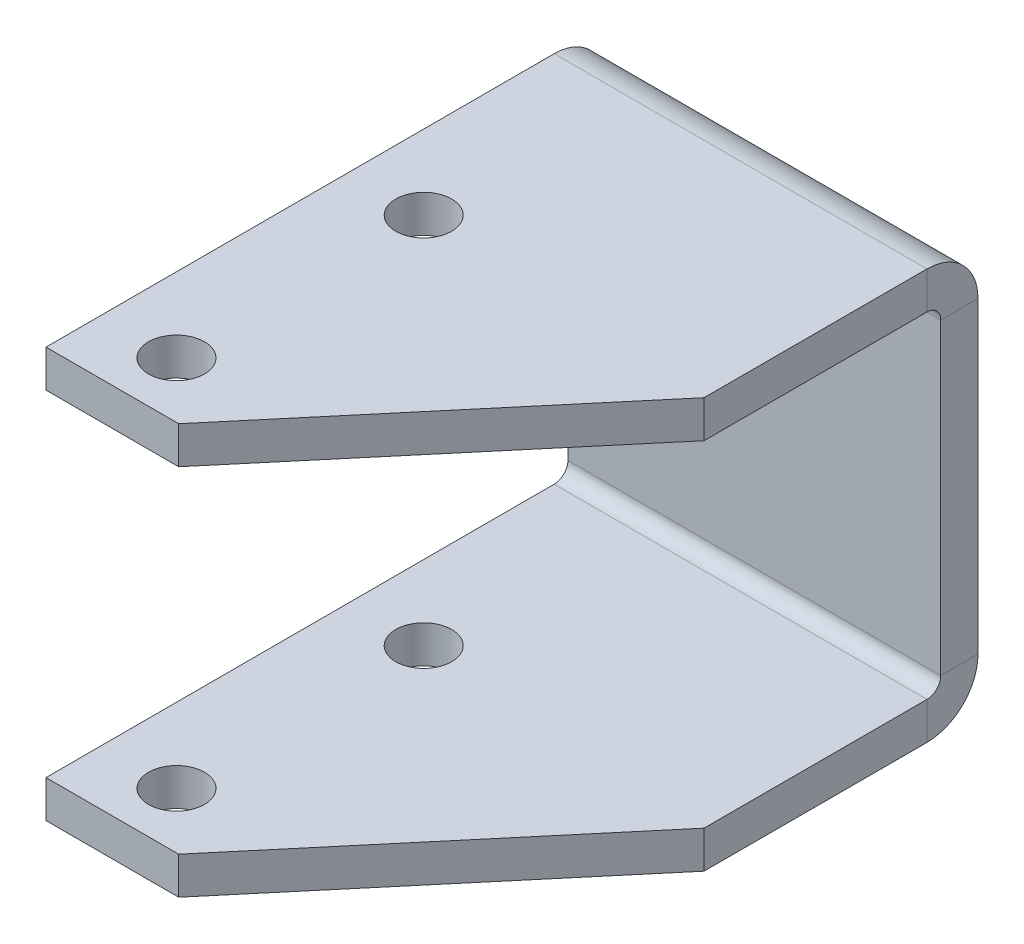
ISO-10303-21;
HEADER;
FILE_DESCRIPTION(('STEP AP214'),'2;1');
FILE_NAME('part.step','',(''),(''),'','','');
FILE_SCHEMA(('AUTOMOTIVE_DESIGN { 1 0 10303 214 1 1 1 1 }'));
ENDSEC;
DATA;
#1=APPLICATION_CONTEXT('core data for automotive mechanical design processes');
#2=APPLICATION_PROTOCOL_DEFINITION('international standard','automotive_design',2000,#1);
#3=PRODUCT_CONTEXT('',#1,'mechanical');
#4=PRODUCT('Part','Part','',(#3));
#5=PRODUCT_RELATED_PRODUCT_CATEGORY('part','',(#4));
#6=PRODUCT_DEFINITION_FORMATION('','',#4);
#7=PRODUCT_DEFINITION_CONTEXT('part definition',#1,'design');
#8=PRODUCT_DEFINITION('design','',#6,#7);
#9=PRODUCT_DEFINITION_SHAPE('','',#8);
#10=(LENGTH_UNIT() NAMED_UNIT(*) SI_UNIT(.MILLI.,.METRE.));
#11=(NAMED_UNIT(*) PLANE_ANGLE_UNIT() SI_UNIT($,.RADIAN.));
#12=(NAMED_UNIT(*) SI_UNIT($,.STERADIAN.) SOLID_ANGLE_UNIT());
#13=UNCERTAINTY_MEASURE_WITH_UNIT(LENGTH_MEASURE(1.E-05),#10,'distance_accuracy_value','');
#14=(GEOMETRIC_REPRESENTATION_CONTEXT(3) GLOBAL_UNCERTAINTY_ASSIGNED_CONTEXT((#13)) GLOBAL_UNIT_ASSIGNED_CONTEXT((#10,
#11,#12)) REPRESENTATION_CONTEXT('',''));
#15=CARTESIAN_POINT('',(0.,0.,0.));
#16=DIRECTION('',(0.,0.,1.));
#17=DIRECTION('',(1.,0.,0.));
#18=AXIS2_PLACEMENT_3D('',#15,#16,#17);
#19=CARTESIAN_POINT('',(0.,0.,-2.));
#20=DIRECTION('',(0.,0.,1.));
#21=DIRECTION('',(1.,0.,0.));
#22=AXIS2_PLACEMENT_3D('',#19,#20,#21);
#23=PLANE('',#22);
#24=DIRECTION('',(1.,0.,0.));
#25=VECTOR('',#24,1.);
#26=CARTESIAN_POINT('',(20.,0.736599999999996,-2.));
#27=LINE('',#26,#25);
#28=CARTESIAN_POINT('',(20.,0.736599999999996,-2.));
#29=VERTEX_POINT('',#28);
#30=CARTESIAN_POINT('',(0.,0.73660000000001,-2.));
#31=VERTEX_POINT('',#30);
#32=EDGE_CURVE('E276',#29,#31,#27,.F.);
#33=ORIENTED_EDGE('',*,*,#32,.T.);
#34=DIRECTION('',(0.,-1.,0.));
#35=VECTOR('',#34,1.);
#36=CARTESIAN_POINT('',(0.,18.,-2.));
#37=LINE('',#36,#35);
#38=CARTESIAN_POINT('',(0.,17.2634,-2.));
#39=VERTEX_POINT('',#38);
#40=EDGE_CURVE('E210',#39,#31,#37,.T.);
#41=ORIENTED_EDGE('',*,*,#40,.F.);
#42=DIRECTION('',(-1.,0.,0.));
#43=VECTOR('',#42,1.);
#44=CARTESIAN_POINT('',(0.,17.2634,-2.));
#45=LINE('',#44,#43);
#46=CARTESIAN_POINT('',(20.,17.2634,-2.));
#47=VERTEX_POINT('',#46);
#48=EDGE_CURVE('E186',#39,#47,#45,.F.);
#49=ORIENTED_EDGE('',*,*,#48,.T.);
#50=DIRECTION('',(0.,1.,0.));
#51=VECTOR('',#50,1.);
#52=CARTESIAN_POINT('',(20.,0.,-2.));
#53=LINE('',#52,#51);
#54=EDGE_CURVE('E51',#29,#47,#53,.T.);
#55=ORIENTED_EDGE('',*,*,#54,.F.);
#56=EDGE_LOOP('',(#33,#41,#49,#55));
#57=FACE_BOUND('',#56,.T.);
#58=ADVANCED_FACE('F42',(#57),#23,.F.);
#59=CARTESIAN_POINT('',(0.,0.,0.));
#60=DIRECTION('',(0.,0.,1.));
#61=DIRECTION('',(1.,0.,0.));
#62=AXIS2_PLACEMENT_3D('',#59,#60,#61);
#63=PLANE('',#62);
#64=DIRECTION('',(0.,-1.,0.));
#65=VECTOR('',#64,1.);
#66=CARTESIAN_POINT('',(0.,18.,0.));
#67=LINE('',#66,#65);
#68=CARTESIAN_POINT('',(0.,17.2634,0.));
#69=VERTEX_POINT('',#68);
#70=CARTESIAN_POINT('',(0.,0.736599999999996,0.));
#71=VERTEX_POINT('',#70);
#72=EDGE_CURVE('E207',#69,#71,#67,.T.);
#73=ORIENTED_EDGE('',*,*,#72,.T.);
#74=DIRECTION('',(1.,0.,0.));
#75=VECTOR('',#74,1.);
#76=CARTESIAN_POINT('',(20.,0.736599999999997,0.));
#77=LINE('',#76,#75);
#78=CARTESIAN_POINT('',(20.,0.736599999999997,0.));
#79=VERTEX_POINT('',#78);
#80=EDGE_CURVE('E288',#79,#71,#77,.F.);
#81=ORIENTED_EDGE('',*,*,#80,.F.);
#82=DIRECTION('',(0.,1.,0.));
#83=VECTOR('',#82,1.);
#84=CARTESIAN_POINT('',(20.,0.,0.));
#85=LINE('',#84,#83);
#86=CARTESIAN_POINT('',(20.,17.2634,0.));
#87=VERTEX_POINT('',#86);
#88=EDGE_CURVE('E213',#79,#87,#85,.T.);
#89=ORIENTED_EDGE('',*,*,#88,.T.);
#90=DIRECTION('',(-1.,0.,0.));
#91=VECTOR('',#90,1.);
#92=CARTESIAN_POINT('',(0.,17.2634,0.));
#93=LINE('',#92,#91);
#94=EDGE_CURVE('E199',#69,#87,#93,.F.);
#95=ORIENTED_EDGE('',*,*,#94,.F.);
#96=EDGE_LOOP('',(#73,#81,#89,#95));
#97=FACE_BOUND('',#96,.T.);
#98=ADVANCED_FACE('F322',(#97),#63,.T.);
#99=CARTESIAN_POINT('',(20.,0.,-2.));
#100=DIRECTION('',(1.,0.,0.));
#101=DIRECTION('',(0.,1.,0.));
#102=AXIS2_PLACEMENT_3D('',#99,#100,#101);
#103=PLANE('',#102);
#104=ORIENTED_EDGE('',*,*,#88,.F.);
#105=DIRECTION('',(0.,0.,-1.));
#106=VECTOR('',#105,1.);
#107=CARTESIAN_POINT('',(20.,0.736599999999997,0.));
#108=LINE('',#107,#106);
#109=EDGE_CURVE('E282',#79,#29,#108,.T.);
#110=ORIENTED_EDGE('',*,*,#109,.T.);
#111=ORIENTED_EDGE('',*,*,#54,.T.);
#112=DIRECTION('',(0.,0.,-1.));
#113=VECTOR('',#112,1.);
#114=CARTESIAN_POINT('',(20.,17.2634,0.));
#115=LINE('',#114,#113);
#116=EDGE_CURVE('E204',#87,#47,#115,.T.);
#117=ORIENTED_EDGE('',*,*,#116,.F.);
#118=EDGE_LOOP('',(#104,#110,#111,#117));
#119=FACE_BOUND('',#118,.T.);
#120=ADVANCED_FACE('F315',(#119),#103,.T.);
#121=CARTESIAN_POINT('',(0.,18.,-2.));
#122=DIRECTION('',(-1.,0.,0.));
#123=DIRECTION('',(0.,-1.,0.));
#124=AXIS2_PLACEMENT_3D('',#121,#122,#123);
#125=PLANE('',#124);
#126=DIRECTION('',(0.,0.,-1.));
#127=VECTOR('',#126,1.);
#128=CARTESIAN_POINT('',(0.,0.736599999999996,0.));
#129=LINE('',#128,#127);
#130=EDGE_CURVE('E293',#71,#31,#129,.T.);
#131=ORIENTED_EDGE('',*,*,#130,.F.);
#132=ORIENTED_EDGE('',*,*,#72,.F.);
#133=DIRECTION('',(0.,0.,-1.));
#134=VECTOR('',#133,1.);
#135=CARTESIAN_POINT('',(0.,17.2634,0.));
#136=LINE('',#135,#134);
#137=EDGE_CURVE('E193',#69,#39,#136,.T.);
#138=ORIENTED_EDGE('',*,*,#137,.T.);
#139=ORIENTED_EDGE('',*,*,#40,.T.);
#140=EDGE_LOOP('',(#131,#132,#138,#139));
#141=FACE_BOUND('',#140,.T.);
#142=ADVANCED_FACE('F44',(#141),#125,.T.);
#143=CARTESIAN_POINT('',(20.,17.2634,0.7366));
#144=DIRECTION('',(1.,0.,0.));
#145=DIRECTION('',(0.,0.,-1.));
#146=AXIS2_PLACEMENT_3D('',#143,#144,#145);
#147=PLANE('',#146);
#148=DIRECTION('',(0.,1.,0.));
#149=VECTOR('',#148,1.);
#150=CARTESIAN_POINT('',(20.,18.,0.736599999999997));
#151=LINE('',#150,#149);
#152=CARTESIAN_POINT('',(20.,18.,0.736599999999997));
#153=VERTEX_POINT('',#152);
#154=CARTESIAN_POINT('',(20.,20.,0.73659999999999));
#155=VERTEX_POINT('',#154);
#156=EDGE_CURVE('E165',#153,#155,#151,.T.);
#157=ORIENTED_EDGE('',*,*,#156,.F.);
#158=CARTESIAN_POINT('',(20.,17.2634,0.7366));
#159=DIRECTION('',(-1.,0.,0.));
#160=DIRECTION('',(0.,0.,1.));
#161=AXIS2_PLACEMENT_3D('',#158,#159,#160);
#162=CIRCLE('',#161,0.736600000000004);
#163=EDGE_CURVE('E196',#87,#153,#162,.F.);
#164=ORIENTED_EDGE('',*,*,#163,.F.);
#165=ORIENTED_EDGE('',*,*,#116,.T.);
#166=CARTESIAN_POINT('',(20.,17.2634,0.7366));
#167=DIRECTION('',(-1.,0.,0.));
#168=DIRECTION('',(0.,0.,1.));
#169=AXIS2_PLACEMENT_3D('',#166,#167,#168);
#170=CIRCLE('',#169,2.7366);
#171=EDGE_CURVE('E189',#47,#155,#170,.F.);
#172=ORIENTED_EDGE('',*,*,#171,.T.);
#173=EDGE_LOOP('',(#157,#164,#165,#172));
#174=FACE_BOUND('',#173,.T.);
#175=ADVANCED_FACE('F310',(#174),#147,.T.);
#176=CARTESIAN_POINT('',(0.,17.2634,0.7366));
#177=DIRECTION('',(1.,0.,0.));
#178=DIRECTION('',(0.,0.,-1.));
#179=AXIS2_PLACEMENT_3D('',#176,#177,#178);
#180=PLANE('',#179);
#181=CARTESIAN_POINT('',(0.,17.2634,0.7366));
#182=DIRECTION('',(-1.,0.,0.));
#183=DIRECTION('',(0.,0.,1.));
#184=AXIS2_PLACEMENT_3D('',#181,#182,#183);
#185=CIRCLE('',#184,0.736600000000004);
#186=CARTESIAN_POINT('',(0.,18.,0.736599999999997));
#187=VERTEX_POINT('',#186);
#188=EDGE_CURVE('E185',#187,#69,#185,.T.);
#189=ORIENTED_EDGE('',*,*,#188,.F.);
#190=DIRECTION('',(0.,1.,0.));
#191=VECTOR('',#190,1.);
#192=CARTESIAN_POINT('',(0.,18.,0.736599999999997));
#193=LINE('',#192,#191);
#194=CARTESIAN_POINT('',(0.,20.,0.73659999999999));
#195=VERTEX_POINT('',#194);
#196=EDGE_CURVE('E300',#187,#195,#193,.T.);
#197=ORIENTED_EDGE('',*,*,#196,.T.);
#198=CARTESIAN_POINT('',(0.,17.2634,0.7366));
#199=DIRECTION('',(-1.,0.,0.));
#200=DIRECTION('',(0.,0.,1.));
#201=AXIS2_PLACEMENT_3D('',#198,#199,#200);
#202=CIRCLE('',#201,2.7366);
#203=EDGE_CURVE('E190',#195,#39,#202,.T.);
#204=ORIENTED_EDGE('',*,*,#203,.T.);
#205=ORIENTED_EDGE('',*,*,#137,.F.);
#206=EDGE_LOOP('',(#189,#197,#204,#205));
#207=FACE_BOUND('',#206,.T.);
#208=ADVANCED_FACE('F325',(#207),#180,.F.);
#209=CARTESIAN_POINT('',(0.,17.2634,0.7366));
#210=DIRECTION('',(-1.,0.,0.));
#211=DIRECTION('',(0.,1.,0.));
#212=AXIS2_PLACEMENT_3D('',#209,#210,#211);
#213=CYLINDRICAL_SURFACE('',#212,2.7366);
#214=ORIENTED_EDGE('',*,*,#48,.F.);
#215=ORIENTED_EDGE('',*,*,#203,.F.);
#216=DIRECTION('',(1.,0.,0.));
#217=VECTOR('',#216,1.);
#218=CARTESIAN_POINT('',(0.,20.,0.73659999999999));
#219=LINE('',#218,#217);
#220=EDGE_CURVE('E174',#195,#155,#219,.T.);
#221=ORIENTED_EDGE('',*,*,#220,.T.);
#222=ORIENTED_EDGE('',*,*,#171,.F.);
#223=EDGE_LOOP('',(#214,#215,#221,#222));
#224=FACE_BOUND('',#223,.T.);
#225=ADVANCED_FACE('F308',(#224),#213,.T.);
#226=CARTESIAN_POINT('',(0.,17.2634,0.7366));
#227=DIRECTION('',(-1.,0.,0.));
#228=DIRECTION('',(0.,1.,0.));
#229=AXIS2_PLACEMENT_3D('',#226,#227,#228);
#230=CYLINDRICAL_SURFACE('',#229,0.736600000000004);
#231=ORIENTED_EDGE('',*,*,#94,.T.);
#232=ORIENTED_EDGE('',*,*,#163,.T.);
#233=DIRECTION('',(-1.,0.,0.));
#234=VECTOR('',#233,1.);
#235=CARTESIAN_POINT('',(20.,18.,0.736599999999997));
#236=LINE('',#235,#234);
#237=EDGE_CURVE('E298',#153,#187,#236,.T.);
#238=ORIENTED_EDGE('',*,*,#237,.T.);
#239=ORIENTED_EDGE('',*,*,#188,.T.);
#240=EDGE_LOOP('',(#231,#232,#238,#239));
#241=FACE_BOUND('',#240,.T.);
#242=ADVANCED_FACE('F318',(#241),#230,.F.);
#243=CARTESIAN_POINT('',(0.,20.0000000000001,28.));
#244=DIRECTION('',(-1.,0.,0.));
#245=DIRECTION('',(0.,-1.,0.));
#246=AXIS2_PLACEMENT_3D('',#243,#244,#245);
#247=PLANE('',#246);
#248=DIRECTION('',(0.,0.,-1.));
#249=VECTOR('',#248,1.);
#250=CARTESIAN_POINT('',(0.,20.0000000000001,28.));
#251=LINE('',#250,#249);
#252=CARTESIAN_POINT('',(0.,20.0000000000001,28.));
#253=VERTEX_POINT('',#252);
#254=EDGE_CURVE('E168',#253,#195,#251,.T.);
#255=ORIENTED_EDGE('',*,*,#254,.T.);
#256=ORIENTED_EDGE('',*,*,#196,.F.);
#257=DIRECTION('',(0.,0.,-1.));
#258=VECTOR('',#257,1.);
#259=CARTESIAN_POINT('',(0.,18.0000000000001,28.));
#260=LINE('',#259,#258);
#261=CARTESIAN_POINT('',(0.,18.0000000000001,28.));
#262=VERTEX_POINT('',#261);
#263=EDGE_CURVE('E166',#262,#187,#260,.T.);
#264=ORIENTED_EDGE('',*,*,#263,.F.);
#265=DIRECTION('',(0.,-1.,0.));
#266=VECTOR('',#265,1.);
#267=CARTESIAN_POINT('',(0.,20.0000000000001,28.));
#268=LINE('',#267,#266);
#269=EDGE_CURVE('E179',#253,#262,#268,.T.);
#270=ORIENTED_EDGE('',*,*,#269,.F.);
#271=EDGE_LOOP('',(#255,#256,#264,#270));
#272=FACE_BOUND('',#271,.T.);
#273=ADVANCED_FACE('F328',(#272),#247,.T.);
#274=CARTESIAN_POINT('',(20.,20.,0.));
#275=DIRECTION('',(1.,0.,0.));
#276=DIRECTION('',(0.,0.,-1.));
#277=AXIS2_PLACEMENT_3D('',#274,#275,#276);
#278=PLANE('',#277);
#279=DIRECTION('',(0.,-1.,0.));
#280=VECTOR('',#279,1.);
#281=CARTESIAN_POINT('',(20.,20.0000000000001,12.6999999999999));
#282=LINE('',#281,#280);
#283=CARTESIAN_POINT('',(20.,20.0000000000001,12.6999999999999));
#284=VERTEX_POINT('',#283);
#285=CARTESIAN_POINT('',(20.,18.0000000000001,12.6999999999999));
#286=VERTEX_POINT('',#285);
#287=EDGE_CURVE('E142',#284,#286,#282,.T.);
#288=ORIENTED_EDGE('',*,*,#287,.T.);
#289=DIRECTION('',(0.,0.,1.));
#290=VECTOR('',#289,1.);
#291=CARTESIAN_POINT('',(20.,18.,0.));
#292=LINE('',#291,#290);
#293=EDGE_CURVE('E180',#153,#286,#292,.T.);
#294=ORIENTED_EDGE('',*,*,#293,.F.);
#295=ORIENTED_EDGE('',*,*,#156,.T.);
#296=DIRECTION('',(0.,0.,1.));
#297=VECTOR('',#296,1.);
#298=CARTESIAN_POINT('',(20.,20.,0.));
#299=LINE('',#298,#297);
#300=EDGE_CURVE('E157',#155,#284,#299,.T.);
#301=ORIENTED_EDGE('',*,*,#300,.T.);
#302=EDGE_LOOP('',(#288,#294,#295,#301));
#303=FACE_BOUND('',#302,.T.);
#304=ADVANCED_FACE('F164',(#303),#278,.T.);
#305=CARTESIAN_POINT('',(0.,20.,0.));
#306=DIRECTION('',(0.,-1.,0.));
#307=DIRECTION('',(0.,0.,-1.));
#308=AXIS2_PLACEMENT_3D('',#305,#306,#307);
#309=PLANE('',#308);
#310=CARTESIAN_POINT('',(3.99999999999999,20.,11.7366));
#311=DIRECTION('',(0.,-1.,0.));
#312=DIRECTION('',(0.,0.,-1.));
#313=AXIS2_PLACEMENT_3D('',#310,#311,#312);
#314=CIRCLE('',#313,1.5);
#315=CARTESIAN_POINT('',(3.99999999999999,20.,10.2366));
#316=VERTEX_POINT('',#315);
#317=EDGE_CURVE('E161',#316,#316,#314,.T.);
#318=ORIENTED_EDGE('',*,*,#317,.T.);
#319=EDGE_LOOP('',(#318));
#320=FACE_BOUND('',#319,.T.);
#321=CARTESIAN_POINT('',(3.99999999999999,20.0000000000001,25.));
#322=DIRECTION('',(0.,-1.,0.));
#323=DIRECTION('',(0.,0.,-1.));
#324=AXIS2_PLACEMENT_3D('',#321,#322,#323);
#325=CIRCLE('',#324,1.5);
#326=CARTESIAN_POINT('',(3.99999999999999,20.0000000000001,23.5));
#327=VERTEX_POINT('',#326);
#328=EDGE_CURVE('E224',#327,#327,#325,.T.);
#329=ORIENTED_EDGE('',*,*,#328,.T.);
#330=EDGE_LOOP('',(#329));
#331=FACE_BOUND('',#330,.T.);
#332=DIRECTION('',(-1.,0.,0.));
#333=VECTOR('',#332,1.);
#334=CARTESIAN_POINT('',(20.,20.0000000000001,28.));
#335=LINE('',#334,#333);
#336=CARTESIAN_POINT('',(7.11939442417399,20.0000000000001,28.));
#337=VERTEX_POINT('',#336);
#338=EDGE_CURVE('E159',#337,#253,#335,.T.);
#339=ORIENTED_EDGE('',*,*,#338,.F.);
#340=DIRECTION('',(0.6440302787913,0.,-0.765));
#341=VECTOR('',#340,1.);
#342=CARTESIAN_POINT('',(7.11939442417399,20.0000000000002,27.9999999999999));
#343=LINE('',#342,#341);
#344=EDGE_CURVE('E59',#337,#284,#343,.T.);
#345=ORIENTED_EDGE('',*,*,#344,.T.);
#346=ORIENTED_EDGE('',*,*,#300,.F.);
#347=ORIENTED_EDGE('',*,*,#220,.F.);
#348=ORIENTED_EDGE('',*,*,#254,.F.);
#349=EDGE_LOOP('',(#339,#345,#346,#347,#348));
#350=FACE_BOUND('',#349,.T.);
#351=ADVANCED_FACE('F155',(#320,#331,#350),#309,.F.);
#352=CARTESIAN_POINT('',(0.,18.,0.));
#353=DIRECTION('',(0.,-1.,0.));
#354=DIRECTION('',(0.,0.,-1.));
#355=AXIS2_PLACEMENT_3D('',#352,#353,#354);
#356=PLANE('',#355);
#357=CARTESIAN_POINT('',(3.99999999999999,18.,11.7366));
#358=DIRECTION('',(0.,-1.,0.));
#359=DIRECTION('',(0.,0.,-1.));
#360=AXIS2_PLACEMENT_3D('',#357,#358,#359);
#361=CIRCLE('',#360,1.5);
#362=CARTESIAN_POINT('',(3.99999999999999,18.,10.2366));
#363=VERTEX_POINT('',#362);
#364=EDGE_CURVE('E236',#363,#363,#361,.T.);
#365=ORIENTED_EDGE('',*,*,#364,.F.);
#366=EDGE_LOOP('',(#365));
#367=FACE_BOUND('',#366,.T.);
#368=CARTESIAN_POINT('',(3.99999999999999,18.0000000000001,25.));
#369=DIRECTION('',(0.,-1.,0.));
#370=DIRECTION('',(0.,0.,-1.));
#371=AXIS2_PLACEMENT_3D('',#368,#369,#370);
#372=CIRCLE('',#371,1.5);
#373=CARTESIAN_POINT('',(3.99999999999999,18.0000000000001,23.5));
#374=VERTEX_POINT('',#373);
#375=EDGE_CURVE('E219',#374,#374,#372,.T.);
#376=ORIENTED_EDGE('',*,*,#375,.F.);
#377=EDGE_LOOP('',(#376));
#378=FACE_BOUND('',#377,.T.);
#379=DIRECTION('',(0.644030278791301,0.,-0.765));
#380=VECTOR('',#379,1.);
#381=CARTESIAN_POINT('',(17.9615761735969,18.0000000000001,15.1213057655068));
#382=LINE('',#381,#380);
#383=CARTESIAN_POINT('',(7.11939442417399,18.0000000000001,27.9999999999999));
#384=VERTEX_POINT('',#383);
#385=EDGE_CURVE('E145',#384,#286,#382,.T.);
#386=ORIENTED_EDGE('',*,*,#385,.F.);
#387=DIRECTION('',(-1.,0.,0.));
#388=VECTOR('',#387,1.);
#389=CARTESIAN_POINT('',(20.,18.0000000000001,28.));
#390=LINE('',#389,#388);
#391=EDGE_CURVE('E171',#384,#262,#390,.T.);
#392=ORIENTED_EDGE('',*,*,#391,.T.);
#393=ORIENTED_EDGE('',*,*,#263,.T.);
#394=ORIENTED_EDGE('',*,*,#237,.F.);
#395=ORIENTED_EDGE('',*,*,#293,.T.);
#396=EDGE_LOOP('',(#386,#392,#393,#394,#395));
#397=FACE_BOUND('',#396,.T.);
#398=ADVANCED_FACE('F331',(#367,#378,#397),#356,.T.);
#399=CARTESIAN_POINT('',(20.,20.0000000000001,28.));
#400=DIRECTION('',(0.,0.,1.));
#401=DIRECTION('',(0.,-1.,0.));
#402=AXIS2_PLACEMENT_3D('',#399,#400,#401);
#403=PLANE('',#402);
#404=DIRECTION('',(0.,-1.,0.));
#405=VECTOR('',#404,1.);
#406=CARTESIAN_POINT('',(7.11939442417399,20.0000000000002,27.9999999999999));
#407=LINE('',#406,#405);
#408=EDGE_CURVE('E160',#337,#384,#407,.T.);
#409=ORIENTED_EDGE('',*,*,#408,.F.);
#410=ORIENTED_EDGE('',*,*,#338,.T.);
#411=ORIENTED_EDGE('',*,*,#269,.T.);
#412=ORIENTED_EDGE('',*,*,#391,.F.);
#413=EDGE_LOOP('',(#409,#410,#411,#412));
#414=FACE_BOUND('',#413,.T.);
#415=ADVANCED_FACE('F334',(#414),#403,.T.);
#416=CARTESIAN_POINT('',(0.,0.736599999999997,0.7366));
#417=DIRECTION('',(-1.,0.,0.));
#418=DIRECTION('',(0.,-1.,0.));
#419=AXIS2_PLACEMENT_3D('',#416,#417,#418);
#420=PLANE('',#419);
#421=DIRECTION('',(0.,-1.,0.));
#422=VECTOR('',#421,1.);
#423=CARTESIAN_POINT('',(0.,0.,0.736599999999997));
#424=LINE('',#423,#422);
#425=CARTESIAN_POINT('',(0.,0.,0.736599999999997));
#426=VERTEX_POINT('',#425);
#427=CARTESIAN_POINT('',(0.,-2.,0.73659999999999));
#428=VERTEX_POINT('',#427);
#429=EDGE_CURVE('E247',#426,#428,#424,.T.);
#430=ORIENTED_EDGE('',*,*,#429,.F.);
#431=CARTESIAN_POINT('',(0.,0.736599999999997,0.7366));
#432=DIRECTION('',(1.,0.,0.));
#433=DIRECTION('',(0.,1.,0.));
#434=AXIS2_PLACEMENT_3D('',#431,#432,#433);
#435=CIRCLE('',#434,0.736599999999999);
#436=EDGE_CURVE('E285',#71,#426,#435,.F.);
#437=ORIENTED_EDGE('',*,*,#436,.F.);
#438=ORIENTED_EDGE('',*,*,#130,.T.);
#439=CARTESIAN_POINT('',(0.,0.736599999999997,0.7366));
#440=DIRECTION('',(1.,0.,0.));
#441=DIRECTION('',(0.,1.,0.));
#442=AXIS2_PLACEMENT_3D('',#439,#440,#441);
#443=CIRCLE('',#442,2.7366);
#444=EDGE_CURVE('E278',#31,#428,#443,.F.);
#445=ORIENTED_EDGE('',*,*,#444,.T.);
#446=EDGE_LOOP('',(#430,#437,#438,#445));
#447=FACE_BOUND('',#446,.T.);
#448=ADVANCED_FACE('F336',(#447),#420,.T.);
#449=CARTESIAN_POINT('',(20.,0.736599999999998,0.7366));
#450=DIRECTION('',(-1.,0.,0.));
#451=DIRECTION('',(0.,-1.,0.));
#452=AXIS2_PLACEMENT_3D('',#449,#450,#451);
#453=PLANE('',#452);
#454=CARTESIAN_POINT('',(20.,0.736599999999998,0.7366));
#455=DIRECTION('',(1.,0.,0.));
#456=DIRECTION('',(0.,1.,0.));
#457=AXIS2_PLACEMENT_3D('',#454,#455,#456);
#458=CIRCLE('',#457,0.736599999999999);
#459=CARTESIAN_POINT('',(20.,0.,0.736599999999997));
#460=VERTEX_POINT('',#459);
#461=EDGE_CURVE('E275',#460,#79,#458,.T.);
#462=ORIENTED_EDGE('',*,*,#461,.F.);
#463=DIRECTION('',(0.,-1.,0.));
#464=VECTOR('',#463,1.);
#465=CARTESIAN_POINT('',(20.,0.,0.736599999999997));
#466=LINE('',#465,#464);
#467=CARTESIAN_POINT('',(20.,-2.,0.73659999999999));
#468=VERTEX_POINT('',#467);
#469=EDGE_CURVE('E251',#460,#468,#466,.T.);
#470=ORIENTED_EDGE('',*,*,#469,.T.);
#471=CARTESIAN_POINT('',(20.,0.736599999999998,0.7366));
#472=DIRECTION('',(1.,0.,0.));
#473=DIRECTION('',(0.,1.,0.));
#474=AXIS2_PLACEMENT_3D('',#471,#472,#473);
#475=CIRCLE('',#474,2.7366);
#476=EDGE_CURVE('E279',#468,#29,#475,.T.);
#477=ORIENTED_EDGE('',*,*,#476,.T.);
#478=ORIENTED_EDGE('',*,*,#109,.F.);
#479=EDGE_LOOP('',(#462,#470,#477,#478));
#480=FACE_BOUND('',#479,.T.);
#481=ADVANCED_FACE('F342',(#480),#453,.F.);
#482=CARTESIAN_POINT('',(20.,0.736599999999998,0.7366));
#483=DIRECTION('',(1.,0.,0.));
#484=DIRECTION('',(0.,-1.,0.));
#485=AXIS2_PLACEMENT_3D('',#482,#483,#484);
#486=CYLINDRICAL_SURFACE('',#485,2.7366);
#487=ORIENTED_EDGE('',*,*,#32,.F.);
#488=ORIENTED_EDGE('',*,*,#476,.F.);
#489=DIRECTION('',(-1.,0.,0.));
#490=VECTOR('',#489,1.);
#491=CARTESIAN_POINT('',(0.,-2.,0.73659999999999));
#492=LINE('',#491,#490);
#493=EDGE_CURVE('E254',#468,#428,#492,.T.);
#494=ORIENTED_EDGE('',*,*,#493,.T.);
#495=ORIENTED_EDGE('',*,*,#444,.F.);
#496=EDGE_LOOP('',(#487,#488,#494,#495));
#497=FACE_BOUND('',#496,.T.);
#498=ADVANCED_FACE('F383',(#497),#486,.T.);
#499=CARTESIAN_POINT('',(20.,0.736599999999998,0.7366));
#500=DIRECTION('',(1.,0.,0.));
#501=DIRECTION('',(0.,-1.,0.));
#502=AXIS2_PLACEMENT_3D('',#499,#500,#501);
#503=CYLINDRICAL_SURFACE('',#502,0.736599999999999);
#504=ORIENTED_EDGE('',*,*,#80,.T.);
#505=ORIENTED_EDGE('',*,*,#436,.T.);
#506=DIRECTION('',(1.,0.,0.));
#507=VECTOR('',#506,1.);
#508=CARTESIAN_POINT('',(0.,0.,0.736599999999997));
#509=LINE('',#508,#507);
#510=EDGE_CURVE('E248',#426,#460,#509,.T.);
#511=ORIENTED_EDGE('',*,*,#510,.T.);
#512=ORIENTED_EDGE('',*,*,#461,.T.);
#513=EDGE_LOOP('',(#504,#505,#511,#512));
#514=FACE_BOUND('',#513,.T.);
#515=ADVANCED_FACE('F386',(#514),#503,.F.);
#516=CARTESIAN_POINT('',(20.,-2.0000000000001,28.));
#517=DIRECTION('',(1.,0.,0.));
#518=DIRECTION('',(0.,0.,-1.));
#519=AXIS2_PLACEMENT_3D('',#516,#517,#518);
#520=PLANE('',#519);
#521=CARTESIAN_POINT('',(20.,0.,12.7));
#522=VERTEX_POINT('',#521);
#523=CARTESIAN_POINT('',(20.,-2.00000000000007,12.7));
#524=VERTEX_POINT('',#523);
#525=EDGE_CURVE('E150',#522,#524,#282,.T.);
#526=ORIENTED_EDGE('',*,*,#525,.T.);
#527=DIRECTION('',(0.,0.,-1.));
#528=VECTOR('',#527,1.);
#529=CARTESIAN_POINT('',(20.,-2.0000000000001,28.));
#530=LINE('',#529,#528);
#531=EDGE_CURVE('E265',#524,#468,#530,.T.);
#532=ORIENTED_EDGE('',*,*,#531,.T.);
#533=ORIENTED_EDGE('',*,*,#469,.F.);
#534=DIRECTION('',(0.,0.,-1.));
#535=VECTOR('',#534,1.);
#536=CARTESIAN_POINT('',(20.,0.,28.));
#537=LINE('',#536,#535);
#538=EDGE_CURVE('E262',#522,#460,#537,.T.);
#539=ORIENTED_EDGE('',*,*,#538,.F.);
#540=EDGE_LOOP('',(#526,#532,#533,#539));
#541=FACE_BOUND('',#540,.T.);
#542=ADVANCED_FACE('F389',(#541),#520,.T.);
#543=CARTESIAN_POINT('',(0.,-2.,0.));
#544=DIRECTION('',(-1.,0.,0.));
#545=DIRECTION('',(0.,0.,1.));
#546=AXIS2_PLACEMENT_3D('',#543,#544,#545);
#547=PLANE('',#546);
#548=DIRECTION('',(0.,0.,1.));
#549=VECTOR('',#548,1.);
#550=CARTESIAN_POINT('',(0.,0.,0.));
#551=LINE('',#550,#549);
#552=CARTESIAN_POINT('',(0.,0.,28.));
#553=VERTEX_POINT('',#552);
#554=EDGE_CURVE('E258',#426,#553,#551,.T.);
#555=ORIENTED_EDGE('',*,*,#554,.F.);
#556=ORIENTED_EDGE('',*,*,#429,.T.);
#557=DIRECTION('',(0.,0.,1.));
#558=VECTOR('',#557,1.);
#559=CARTESIAN_POINT('',(0.,-2.,0.));
#560=LINE('',#559,#558);
#561=CARTESIAN_POINT('',(0.,-2.0000000000001,28.));
#562=VERTEX_POINT('',#561);
#563=EDGE_CURVE('E259',#428,#562,#560,.T.);
#564=ORIENTED_EDGE('',*,*,#563,.T.);
#565=DIRECTION('',(0.,1.,0.));
#566=VECTOR('',#565,1.);
#567=CARTESIAN_POINT('',(0.,-2.0000000000001,28.));
#568=LINE('',#567,#566);
#569=EDGE_CURVE('E267',#562,#553,#568,.T.);
#570=ORIENTED_EDGE('',*,*,#569,.T.);
#571=EDGE_LOOP('',(#555,#556,#564,#570));
#572=FACE_BOUND('',#571,.T.);
#573=ADVANCED_FACE('F394',(#572),#547,.T.);
#574=CARTESIAN_POINT('',(0.,-2.,0.));
#575=DIRECTION('',(0.,1.,0.));
#576=DIRECTION('',(0.,0.,1.));
#577=AXIS2_PLACEMENT_3D('',#574,#575,#576);
#578=PLANE('',#577);
#579=CARTESIAN_POINT('',(4.,-2.00000000000016,11.7366000000001));
#580=DIRECTION('',(0.,1.,0.));
#581=DIRECTION('',(0.,0.,1.));
#582=AXIS2_PLACEMENT_3D('',#579,#580,#581);
#583=CIRCLE('',#582,1.5);
#584=CARTESIAN_POINT('',(4.,-2.00000000000015,13.2366000000001));
#585=VERTEX_POINT('',#584);
#586=EDGE_CURVE('E220',#585,#585,#583,.T.);
#587=ORIENTED_EDGE('',*,*,#586,.T.);
#588=EDGE_LOOP('',(#587));
#589=FACE_BOUND('',#588,.T.);
#590=CARTESIAN_POINT('',(4.,-2.00000000000011,25.0000000000001));
#591=DIRECTION('',(0.,1.,0.));
#592=DIRECTION('',(0.,0.,1.));
#593=AXIS2_PLACEMENT_3D('',#590,#591,#592);
#594=CIRCLE('',#593,1.5);
#595=CARTESIAN_POINT('',(4.,-2.00000000000011,26.5000000000001));
#596=VERTEX_POINT('',#595);
#597=EDGE_CURVE('E227',#596,#596,#594,.T.);
#598=ORIENTED_EDGE('',*,*,#597,.T.);
#599=EDGE_LOOP('',(#598));
#600=FACE_BOUND('',#599,.T.);
#601=ORIENTED_EDGE('',*,*,#531,.F.);
#602=DIRECTION('',(-0.644030278791301,0.,0.765));
#603=VECTOR('',#602,1.);
#604=CARTESIAN_POINT('',(17.9615761735969,-2.00000000000005,15.1213057655069));
#605=LINE('',#604,#603);
#606=CARTESIAN_POINT('',(7.11939442417399,-2.0000000000001,28.));
#607=VERTEX_POINT('',#606);
#608=EDGE_CURVE('E243',#524,#607,#605,.T.);
#609=ORIENTED_EDGE('',*,*,#608,.T.);
#610=DIRECTION('',(1.,0.,0.));
#611=VECTOR('',#610,1.);
#612=CARTESIAN_POINT('',(0.,-2.0000000000001,28.));
#613=LINE('',#612,#611);
#614=EDGE_CURVE('E261',#562,#607,#613,.T.);
#615=ORIENTED_EDGE('',*,*,#614,.F.);
#616=ORIENTED_EDGE('',*,*,#563,.F.);
#617=ORIENTED_EDGE('',*,*,#493,.F.);
#618=EDGE_LOOP('',(#601,#609,#615,#616,#617));
#619=FACE_BOUND('',#618,.T.);
#620=ADVANCED_FACE('F397',(#589,#600,#619),#578,.F.);
#621=CARTESIAN_POINT('',(0.,0.,0.));
#622=DIRECTION('',(0.,1.,0.));
#623=DIRECTION('',(0.,0.,1.));
#624=AXIS2_PLACEMENT_3D('',#621,#622,#623);
#625=PLANE('',#624);
#626=CARTESIAN_POINT('',(4.,0.,11.7366));
#627=DIRECTION('',(0.,1.,0.));
#628=DIRECTION('',(0.,0.,1.));
#629=AXIS2_PLACEMENT_3D('',#626,#627,#628);
#630=CIRCLE('',#629,1.5);
#631=CARTESIAN_POINT('',(4.,0.,13.2366));
#632=VERTEX_POINT('',#631);
#633=EDGE_CURVE('E46',#632,#632,#630,.T.);
#634=ORIENTED_EDGE('',*,*,#633,.F.);
#635=EDGE_LOOP('',(#634));
#636=FACE_BOUND('',#635,.T.);
#637=CARTESIAN_POINT('',(4.,0.,25.0000000000001));
#638=DIRECTION('',(0.,1.,0.));
#639=DIRECTION('',(0.,0.,1.));
#640=AXIS2_PLACEMENT_3D('',#637,#638,#639);
#641=CIRCLE('',#640,1.5);
#642=CARTESIAN_POINT('',(4.,0.,26.5000000000001));
#643=VERTEX_POINT('',#642);
#644=EDGE_CURVE('E217',#643,#643,#641,.T.);
#645=ORIENTED_EDGE('',*,*,#644,.F.);
#646=EDGE_LOOP('',(#645));
#647=FACE_BOUND('',#646,.T.);
#648=DIRECTION('',(-0.644030278791301,0.,0.765));
#649=VECTOR('',#648,1.);
#650=CARTESIAN_POINT('',(17.9615761735969,0.,15.1213057655069));
#651=LINE('',#650,#649);
#652=CARTESIAN_POINT('',(7.11939442417398,0.,28.));
#653=VERTEX_POINT('',#652);
#654=EDGE_CURVE('E66',#522,#653,#651,.T.);
#655=ORIENTED_EDGE('',*,*,#654,.F.);
#656=ORIENTED_EDGE('',*,*,#538,.T.);
#657=ORIENTED_EDGE('',*,*,#510,.F.);
#658=ORIENTED_EDGE('',*,*,#554,.T.);
#659=DIRECTION('',(1.,0.,0.));
#660=VECTOR('',#659,1.);
#661=CARTESIAN_POINT('',(0.,0.,28.));
#662=LINE('',#661,#660);
#663=EDGE_CURVE('E269',#553,#653,#662,.T.);
#664=ORIENTED_EDGE('',*,*,#663,.T.);
#665=EDGE_LOOP('',(#655,#656,#657,#658,#664));
#666=FACE_BOUND('',#665,.T.);
#667=ADVANCED_FACE('F403',(#636,#647,#666),#625,.T.);
#668=CARTESIAN_POINT('',(0.,-2.0000000000001,28.));
#669=DIRECTION('',(0.,0.,1.));
#670=DIRECTION('',(0.,-1.,0.));
#671=AXIS2_PLACEMENT_3D('',#668,#669,#670);
#672=PLANE('',#671);
#673=DIRECTION('',(0.,-1.,0.));
#674=VECTOR('',#673,1.);
#675=CARTESIAN_POINT('',(7.11939442417399,-2.00000000000006,28.));
#676=LINE('',#675,#674);
#677=EDGE_CURVE('E11',#653,#607,#676,.T.);
#678=ORIENTED_EDGE('',*,*,#677,.F.);
#679=ORIENTED_EDGE('',*,*,#663,.F.);
#680=ORIENTED_EDGE('',*,*,#569,.F.);
#681=ORIENTED_EDGE('',*,*,#614,.T.);
#682=EDGE_LOOP('',(#678,#679,#680,#681));
#683=FACE_BOUND('',#682,.T.);
#684=ADVANCED_FACE('F399',(#683),#672,.T.);
#685=CARTESIAN_POINT('',(7.11939442417399,20.0000000000002,27.9999999999999));
#686=DIRECTION('',(-0.765,0.,-0.6440302787913));
#687=DIRECTION('',(-0.644030278791301,0.,0.765));
#688=AXIS2_PLACEMENT_3D('',#685,#686,#687);
#689=PLANE('',#688);
#690=ORIENTED_EDGE('',*,*,#525,.F.);
#691=ORIENTED_EDGE('',*,*,#654,.T.);
#692=ORIENTED_EDGE('',*,*,#677,.T.);
#693=ORIENTED_EDGE('',*,*,#608,.F.);
#694=EDGE_LOOP('',(#690,#691,#692,#693));
#695=FACE_BOUND('',#694,.T.);
#696=ADVANCED_FACE('F402',(#695),#689,.F.);
#697=ORIENTED_EDGE('',*,*,#385,.T.);
#698=ORIENTED_EDGE('',*,*,#287,.F.);
#699=ORIENTED_EDGE('',*,*,#344,.F.);
#700=ORIENTED_EDGE('',*,*,#408,.T.);
#701=EDGE_LOOP('',(#697,#698,#699,#700));
#702=FACE_BOUND('',#701,.T.);
#703=ADVANCED_FACE('F143',(#702),#689,.F.);
#704=CARTESIAN_POINT('',(4.,-2.00000000000011,25.0000000000001));
#705=DIRECTION('',(0.,1.,0.));
#706=DIRECTION('',(0.,0.,1.));
#707=AXIS2_PLACEMENT_3D('',#704,#705,#706);
#708=CYLINDRICAL_SURFACE('',#707,1.5);
#709=ORIENTED_EDGE('',*,*,#644,.T.);
#710=EDGE_LOOP('',(#709));
#711=FACE_BOUND('',#710,.T.);
#712=ORIENTED_EDGE('',*,*,#597,.F.);
#713=EDGE_LOOP('',(#712));
#714=FACE_BOUND('',#713,.T.);
#715=ADVANCED_FACE('F415',(#711,#714),#708,.F.);
#716=CARTESIAN_POINT('',(4.,-2.00000000000016,11.7366000000001));
#717=DIRECTION('',(0.,1.,0.));
#718=DIRECTION('',(0.,0.,1.));
#719=AXIS2_PLACEMENT_3D('',#716,#717,#718);
#720=CYLINDRICAL_SURFACE('',#719,1.5);
#721=ORIENTED_EDGE('',*,*,#633,.T.);
#722=EDGE_LOOP('',(#721));
#723=FACE_BOUND('',#722,.T.);
#724=ORIENTED_EDGE('',*,*,#586,.F.);
#725=EDGE_LOOP('',(#724));
#726=FACE_BOUND('',#725,.T.);
#727=ADVANCED_FACE('F418',(#723,#726),#720,.F.);
#728=ORIENTED_EDGE('',*,*,#375,.T.);
#729=EDGE_LOOP('',(#728));
#730=FACE_BOUND('',#729,.T.);
#731=ORIENTED_EDGE('',*,*,#328,.F.);
#732=EDGE_LOOP('',(#731));
#733=FACE_BOUND('',#732,.T.);
#734=ADVANCED_FACE('F419',(#730,#733),#708,.F.);
#735=ORIENTED_EDGE('',*,*,#364,.T.);
#736=EDGE_LOOP('',(#735));
#737=FACE_BOUND('',#736,.T.);
#738=ORIENTED_EDGE('',*,*,#317,.F.);
#739=EDGE_LOOP('',(#738));
#740=FACE_BOUND('',#739,.T.);
#741=ADVANCED_FACE('F422',(#737,#740),#720,.F.);
#742=CLOSED_SHELL('',(#58,#98,#120,#142,#175,#208,#225,#242,#273,#304,#351,#398,#415,#448,#481,
#498,#515,#542,#573,#620,#667,#684,#696,#703,#715,#727,#734,#741));
#743=MANIFOLD_SOLID_BREP('B2',#742);
#744=ADVANCED_BREP_SHAPE_REPRESENTATION('',(#18,#743),#14);
#745=SHAPE_DEFINITION_REPRESENTATION(#9,#744);
ENDSEC;
END-ISO-10303-21;
